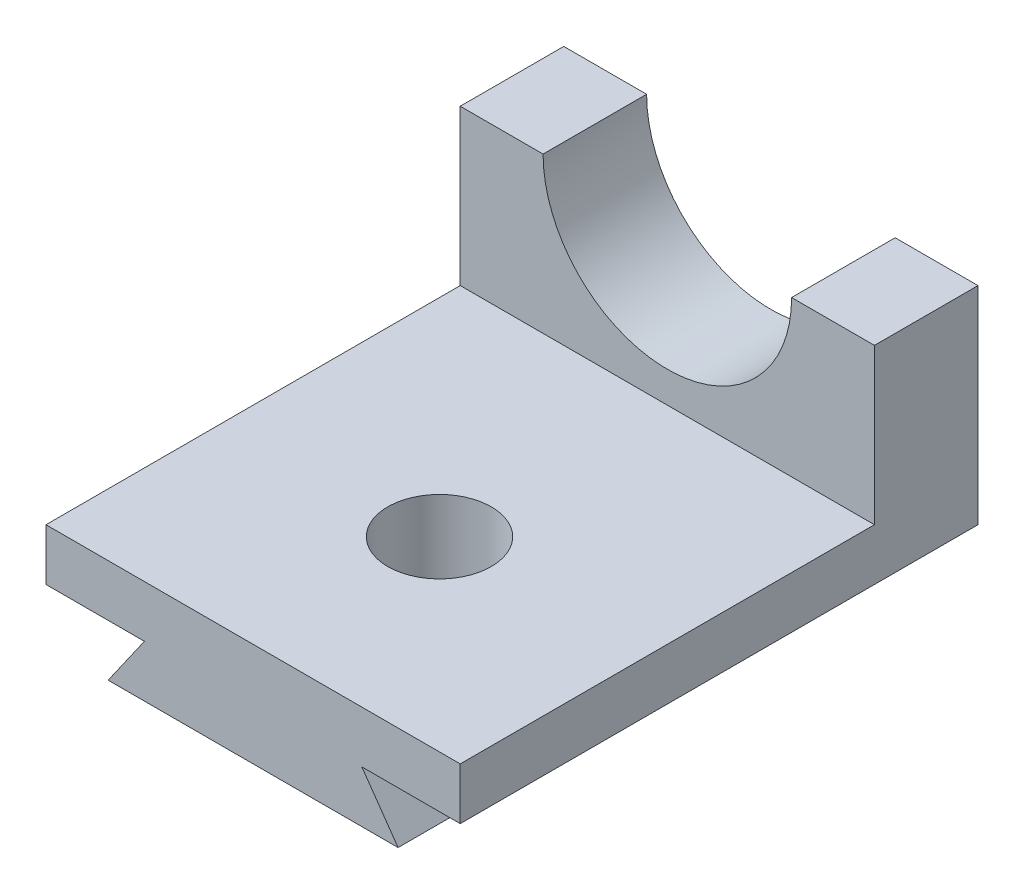
ISO-10303-21;
HEADER;
FILE_DESCRIPTION(('STEP AP214'),'2;1');
FILE_NAME('part.step','',(''),(''),'','','');
FILE_SCHEMA(('AUTOMOTIVE_DESIGN { 1 0 10303 214 1 1 1 1 }'));
ENDSEC;
DATA;
#1=APPLICATION_CONTEXT('core data for automotive mechanical design processes');
#2=APPLICATION_PROTOCOL_DEFINITION('international standard','automotive_design',2000,#1);
#3=PRODUCT_CONTEXT('',#1,'mechanical');
#4=PRODUCT('Part','Part','',(#3));
#5=PRODUCT_RELATED_PRODUCT_CATEGORY('part','',(#4));
#6=PRODUCT_DEFINITION_FORMATION('','',#4);
#7=PRODUCT_DEFINITION_CONTEXT('part definition',#1,'design');
#8=PRODUCT_DEFINITION('design','',#6,#7);
#9=PRODUCT_DEFINITION_SHAPE('','',#8);
#10=(LENGTH_UNIT() NAMED_UNIT(*) SI_UNIT(.MILLI.,.METRE.));
#11=(NAMED_UNIT(*) PLANE_ANGLE_UNIT() SI_UNIT($,.RADIAN.));
#12=(NAMED_UNIT(*) SI_UNIT($,.STERADIAN.) SOLID_ANGLE_UNIT());
#13=UNCERTAINTY_MEASURE_WITH_UNIT(LENGTH_MEASURE(1.E-05),#10,'distance_accuracy_value','');
#14=(GEOMETRIC_REPRESENTATION_CONTEXT(3) GLOBAL_UNCERTAINTY_ASSIGNED_CONTEXT((#13)) GLOBAL_UNIT_ASSIGNED_CONTEXT((#10,
#11,#12)) REPRESENTATION_CONTEXT('',''));
#15=CARTESIAN_POINT('',(0.,0.,0.));
#16=DIRECTION('',(0.,0.,1.));
#17=DIRECTION('',(1.,0.,0.));
#18=AXIS2_PLACEMENT_3D('',#15,#16,#17);
#19=CARTESIAN_POINT('',(0.,15.,0.));
#20=DIRECTION('',(0.,1.,0.));
#21=DIRECTION('',(0.,0.,1.));
#22=AXIS2_PLACEMENT_3D('',#19,#20,#21);
#23=PLANE('',#22);
#24=DIRECTION('',(0.,0.,1.));
#25=VECTOR('',#24,1.);
#26=CARTESIAN_POINT('',(-12.,15.,0.));
#27=LINE('',#26,#25);
#28=CARTESIAN_POINT('',(-12.,15.,0.));
#29=VERTEX_POINT('',#28);
#30=CARTESIAN_POINT('',(-12.,15.,10.));
#31=VERTEX_POINT('',#30);
#32=EDGE_CURVE('E141',#29,#31,#27,.T.);
#33=ORIENTED_EDGE('',*,*,#32,.F.);
#34=DIRECTION('',(-1.,0.,0.));
#35=VECTOR('',#34,1.);
#36=CARTESIAN_POINT('',(-20.,15.,0.));
#37=LINE('',#36,#35);
#38=CARTESIAN_POINT('',(-20.,15.,0.));
#39=VERTEX_POINT('',#38);
#40=EDGE_CURVE('E150',#29,#39,#37,.T.);
#41=ORIENTED_EDGE('',*,*,#40,.T.);
#42=DIRECTION('',(0.,0.,1.));
#43=VECTOR('',#42,1.);
#44=CARTESIAN_POINT('',(-20.,15.,0.));
#45=LINE('',#44,#43);
#46=CARTESIAN_POINT('',(-20.,15.,10.));
#47=VERTEX_POINT('',#46);
#48=EDGE_CURVE('E169',#39,#47,#45,.T.);
#49=ORIENTED_EDGE('',*,*,#48,.T.);
#50=DIRECTION('',(1.,0.,0.));
#51=VECTOR('',#50,1.);
#52=CARTESIAN_POINT('',(-20.,15.,10.));
#53=LINE('',#52,#51);
#54=EDGE_CURVE('E262',#47,#31,#53,.T.);
#55=ORIENTED_EDGE('',*,*,#54,.T.);
#56=EDGE_LOOP('',(#33,#41,#49,#55));
#57=FACE_BOUND('',#56,.T.);
#58=ADVANCED_FACE('F45',(#57),#23,.T.);
#59=CARTESIAN_POINT('',(-20.,0.,50.));
#60=DIRECTION('',(0.,-1.,0.));
#61=DIRECTION('',(0.,0.,-1.));
#62=AXIS2_PLACEMENT_3D('',#59,#60,#61);
#63=PLANE('',#62);
#64=CARTESIAN_POINT('',(0.,0.,32.));
#65=DIRECTION('',(0.,1.,0.));
#66=DIRECTION('',(0.,0.,1.));
#67=AXIS2_PLACEMENT_3D('',#64,#65,#66);
#68=CIRCLE('',#67,5.);
#69=CARTESIAN_POINT('',(0.,0.,37.));
#70=VERTEX_POINT('',#69);
#71=EDGE_CURVE('E174',#70,#70,#68,.T.);
#72=ORIENTED_EDGE('',*,*,#71,.F.);
#73=EDGE_LOOP('',(#72));
#74=FACE_BOUND('',#73,.T.);
#75=DIRECTION('',(1.,0.,0.));
#76=VECTOR('',#75,1.);
#77=CARTESIAN_POINT('',(-20.,0.,10.));
#78=LINE('',#77,#76);
#79=CARTESIAN_POINT('',(-20.,0.,10.));
#80=VERTEX_POINT('',#79);
#81=CARTESIAN_POINT('',(20.,0.,10.));
#82=VERTEX_POINT('',#81);
#83=EDGE_CURVE('E68',#80,#82,#78,.T.);
#84=ORIENTED_EDGE('',*,*,#83,.F.);
#85=DIRECTION('',(0.,0.,-1.));
#86=VECTOR('',#85,1.);
#87=CARTESIAN_POINT('',(-20.,0.,50.));
#88=LINE('',#87,#86);
#89=CARTESIAN_POINT('',(-20.,0.,50.));
#90=VERTEX_POINT('',#89);
#91=EDGE_CURVE('E54',#90,#80,#88,.T.);
#92=ORIENTED_EDGE('',*,*,#91,.F.);
#93=DIRECTION('',(-1.,0.,0.));
#94=VECTOR('',#93,1.);
#95=CARTESIAN_POINT('',(-20.,0.,50.));
#96=LINE('',#95,#94);
#97=CARTESIAN_POINT('',(20.,0.,50.));
#98=VERTEX_POINT('',#97);
#99=EDGE_CURVE('E187',#98,#90,#96,.T.);
#100=ORIENTED_EDGE('',*,*,#99,.F.);
#101=DIRECTION('',(0.,0.,-1.));
#102=VECTOR('',#101,1.);
#103=CARTESIAN_POINT('',(20.,0.,50.));
#104=LINE('',#103,#102);
#105=EDGE_CURVE('E11',#98,#82,#104,.T.);
#106=ORIENTED_EDGE('',*,*,#105,.T.);
#107=EDGE_LOOP('',(#84,#92,#100,#106));
#108=FACE_BOUND('',#107,.T.);
#109=ADVANCED_FACE('F305',(#74,#108),#63,.F.);
#110=CARTESIAN_POINT('',(20.,0.,50.));
#111=DIRECTION('',(-1.,0.,0.));
#112=DIRECTION('',(0.,0.,1.));
#113=AXIS2_PLACEMENT_3D('',#110,#111,#112);
#114=PLANE('',#113);
#115=DIRECTION('',(0.,1.,0.));
#116=VECTOR('',#115,1.);
#117=CARTESIAN_POINT('',(20.,0.,0.));
#118=LINE('',#117,#116);
#119=CARTESIAN_POINT('',(20.,-5.,0.));
#120=VERTEX_POINT('',#119);
#121=CARTESIAN_POINT('',(20.,15.,0.));
#122=VERTEX_POINT('',#121);
#123=EDGE_CURVE('E179',#120,#122,#118,.T.);
#124=ORIENTED_EDGE('',*,*,#123,.T.);
#125=DIRECTION('',(0.,0.,-1.));
#126=VECTOR('',#125,1.);
#127=CARTESIAN_POINT('',(20.,15.,0.));
#128=LINE('',#127,#126);
#129=CARTESIAN_POINT('',(20.,15.,10.));
#130=VERTEX_POINT('',#129);
#131=EDGE_CURVE('E156',#130,#122,#128,.T.);
#132=ORIENTED_EDGE('',*,*,#131,.F.);
#133=DIRECTION('',(0.,-1.,0.));
#134=VECTOR('',#133,1.);
#135=CARTESIAN_POINT('',(20.,15.,10.));
#136=LINE('',#135,#134);
#137=EDGE_CURVE('E158',#130,#82,#136,.T.);
#138=ORIENTED_EDGE('',*,*,#137,.T.);
#139=ORIENTED_EDGE('',*,*,#105,.F.);
#140=DIRECTION('',(0.,1.,0.));
#141=VECTOR('',#140,1.);
#142=CARTESIAN_POINT('',(20.,0.,50.));
#143=LINE('',#142,#141);
#144=CARTESIAN_POINT('',(20.,-5.,50.));
#145=VERTEX_POINT('',#144);
#146=EDGE_CURVE('E183',#145,#98,#143,.T.);
#147=ORIENTED_EDGE('',*,*,#146,.F.);
#148=DIRECTION('',(0.,0.,-1.));
#149=VECTOR('',#148,1.);
#150=CARTESIAN_POINT('',(20.,-5.,50.));
#151=LINE('',#150,#149);
#152=EDGE_CURVE('E209',#145,#120,#151,.T.);
#153=ORIENTED_EDGE('',*,*,#152,.T.);
#154=EDGE_LOOP('',(#124,#132,#138,#139,#147,#153));
#155=FACE_BOUND('',#154,.T.);
#156=ADVANCED_FACE('F47',(#155),#114,.F.);
#157=CARTESIAN_POINT('',(-20.,0.,50.));
#158=DIRECTION('',(1.,0.,0.));
#159=DIRECTION('',(0.,0.,-1.));
#160=AXIS2_PLACEMENT_3D('',#157,#158,#159);
#161=PLANE('',#160);
#162=DIRECTION('',(0.,-1.,0.));
#163=VECTOR('',#162,1.);
#164=CARTESIAN_POINT('',(-20.,0.,0.));
#165=LINE('',#164,#163);
#166=CARTESIAN_POINT('',(-20.,-5.,0.));
#167=VERTEX_POINT('',#166);
#168=EDGE_CURVE('E212',#39,#167,#165,.T.);
#169=ORIENTED_EDGE('',*,*,#168,.T.);
#170=DIRECTION('',(0.,0.,-1.));
#171=VECTOR('',#170,1.);
#172=CARTESIAN_POINT('',(-20.,-5.,50.));
#173=LINE('',#172,#171);
#174=CARTESIAN_POINT('',(-20.,-5.,50.));
#175=VERTEX_POINT('',#174);
#176=EDGE_CURVE('E248',#175,#167,#173,.T.);
#177=ORIENTED_EDGE('',*,*,#176,.F.);
#178=DIRECTION('',(0.,-1.,0.));
#179=VECTOR('',#178,1.);
#180=CARTESIAN_POINT('',(-20.,0.,50.));
#181=LINE('',#180,#179);
#182=EDGE_CURVE('E191',#90,#175,#181,.T.);
#183=ORIENTED_EDGE('',*,*,#182,.F.);
#184=ORIENTED_EDGE('',*,*,#91,.T.);
#185=DIRECTION('',(0.,-1.,0.));
#186=VECTOR('',#185,1.);
#187=CARTESIAN_POINT('',(-20.,15.,10.));
#188=LINE('',#187,#186);
#189=EDGE_CURVE('E163',#47,#80,#188,.T.);
#190=ORIENTED_EDGE('',*,*,#189,.F.);
#191=ORIENTED_EDGE('',*,*,#48,.F.);
#192=EDGE_LOOP('',(#169,#177,#183,#184,#190,#191));
#193=FACE_BOUND('',#192,.T.);
#194=ADVANCED_FACE('F255',(#193),#161,.F.);
#195=CARTESIAN_POINT('',(-20.,-5.,50.));
#196=DIRECTION('',(0.,1.,0.));
#197=DIRECTION('',(-1.,0.,0.));
#198=AXIS2_PLACEMENT_3D('',#195,#196,#197);
#199=PLANE('',#198);
#200=DIRECTION('',(1.,0.,0.));
#201=VECTOR('',#200,1.);
#202=CARTESIAN_POINT('',(-20.,-5.,0.));
#203=LINE('',#202,#201);
#204=CARTESIAN_POINT('',(-10.5,-5.,0.));
#205=VERTEX_POINT('',#204);
#206=EDGE_CURVE('E215',#167,#205,#203,.T.);
#207=ORIENTED_EDGE('',*,*,#206,.T.);
#208=DIRECTION('',(0.,0.,-1.));
#209=VECTOR('',#208,1.);
#210=CARTESIAN_POINT('',(-10.5,-5.,50.));
#211=LINE('',#210,#209);
#212=CARTESIAN_POINT('',(-10.5,-5.,50.));
#213=VERTEX_POINT('',#212);
#214=EDGE_CURVE('E244',#213,#205,#211,.T.);
#215=ORIENTED_EDGE('',*,*,#214,.F.);
#216=DIRECTION('',(1.,0.,0.));
#217=VECTOR('',#216,1.);
#218=CARTESIAN_POINT('',(-20.,-5.,50.));
#219=LINE('',#218,#217);
#220=EDGE_CURVE('E194',#175,#213,#219,.T.);
#221=ORIENTED_EDGE('',*,*,#220,.F.);
#222=ORIENTED_EDGE('',*,*,#176,.T.);
#223=EDGE_LOOP('',(#207,#215,#221,#222));
#224=FACE_BOUND('',#223,.T.);
#225=ADVANCED_FACE('F302',(#224),#199,.F.);
#226=CARTESIAN_POINT('',(-14.,-10.,50.));
#227=DIRECTION('',(0.819231920519041,-0.573462344363328,0.));
#228=DIRECTION('',(0.573462344363328,0.819231920519041,0.));
#229=AXIS2_PLACEMENT_3D('',#226,#227,#228);
#230=PLANE('',#229);
#231=DIRECTION('',(-0.573462344363328,-0.819231920519041,0.));
#232=VECTOR('',#231,1.);
#233=CARTESIAN_POINT('',(-14.,-10.,0.));
#234=LINE('',#233,#232);
#235=CARTESIAN_POINT('',(-14.,-10.,0.));
#236=VERTEX_POINT('',#235);
#237=EDGE_CURVE('E218',#205,#236,#234,.T.);
#238=ORIENTED_EDGE('',*,*,#237,.T.);
#239=DIRECTION('',(0.,0.,-1.));
#240=VECTOR('',#239,1.);
#241=CARTESIAN_POINT('',(-14.,-10.,50.));
#242=LINE('',#241,#240);
#243=CARTESIAN_POINT('',(-14.,-10.,50.));
#244=VERTEX_POINT('',#243);
#245=EDGE_CURVE('E240',#244,#236,#242,.T.);
#246=ORIENTED_EDGE('',*,*,#245,.F.);
#247=DIRECTION('',(-0.573462344363328,-0.819231920519041,0.));
#248=VECTOR('',#247,1.);
#249=CARTESIAN_POINT('',(-14.,-10.,50.));
#250=LINE('',#249,#248);
#251=EDGE_CURVE('E197',#213,#244,#250,.T.);
#252=ORIENTED_EDGE('',*,*,#251,.F.);
#253=ORIENTED_EDGE('',*,*,#214,.T.);
#254=EDGE_LOOP('',(#238,#246,#252,#253));
#255=FACE_BOUND('',#254,.T.);
#256=ADVANCED_FACE('F297',(#255),#230,.F.);
#257=CARTESIAN_POINT('',(-14.,-10.,50.));
#258=DIRECTION('',(0.,1.,0.));
#259=DIRECTION('',(0.,0.,1.));
#260=AXIS2_PLACEMENT_3D('',#257,#258,#259);
#261=PLANE('',#260);
#262=CARTESIAN_POINT('',(0.,-10.,32.));
#263=DIRECTION('',(0.,1.,0.));
#264=DIRECTION('',(0.,0.,1.));
#265=AXIS2_PLACEMENT_3D('',#262,#263,#264);
#266=CIRCLE('',#265,5.);
#267=CARTESIAN_POINT('',(0.,-10.,37.));
#268=VERTEX_POINT('',#267);
#269=EDGE_CURVE('E175',#268,#268,#266,.T.);
#270=ORIENTED_EDGE('',*,*,#269,.T.);
#271=EDGE_LOOP('',(#270));
#272=FACE_BOUND('',#271,.T.);
#273=DIRECTION('',(1.,0.,0.));
#274=VECTOR('',#273,1.);
#275=CARTESIAN_POINT('',(-14.,-10.,0.));
#276=LINE('',#275,#274);
#277=CARTESIAN_POINT('',(14.,-10.,0.));
#278=VERTEX_POINT('',#277);
#279=EDGE_CURVE('E221',#236,#278,#276,.T.);
#280=ORIENTED_EDGE('',*,*,#279,.T.);
#281=DIRECTION('',(0.,0.,-1.));
#282=VECTOR('',#281,1.);
#283=CARTESIAN_POINT('',(14.,-10.,50.));
#284=LINE('',#283,#282);
#285=CARTESIAN_POINT('',(14.,-10.,50.));
#286=VERTEX_POINT('',#285);
#287=EDGE_CURVE('E236',#286,#278,#284,.T.);
#288=ORIENTED_EDGE('',*,*,#287,.F.);
#289=DIRECTION('',(1.,0.,0.));
#290=VECTOR('',#289,1.);
#291=CARTESIAN_POINT('',(-14.,-10.,50.));
#292=LINE('',#291,#290);
#293=EDGE_CURVE('E200',#244,#286,#292,.T.);
#294=ORIENTED_EDGE('',*,*,#293,.F.);
#295=ORIENTED_EDGE('',*,*,#245,.T.);
#296=EDGE_LOOP('',(#280,#288,#294,#295));
#297=FACE_BOUND('',#296,.T.);
#298=ADVANCED_FACE('F292',(#272,#297),#261,.F.);
#299=CARTESIAN_POINT('',(14.,-10.,50.));
#300=DIRECTION('',(-0.819231920519041,-0.573462344363328,0.));
#301=DIRECTION('',(0.573462344363328,-0.819231920519041,0.));
#302=AXIS2_PLACEMENT_3D('',#299,#300,#301);
#303=PLANE('',#302);
#304=DIRECTION('',(-0.573462344363328,0.819231920519041,0.));
#305=VECTOR('',#304,1.);
#306=CARTESIAN_POINT('',(14.,-10.,0.));
#307=LINE('',#306,#305);
#308=CARTESIAN_POINT('',(10.5,-5.,0.));
#309=VERTEX_POINT('',#308);
#310=EDGE_CURVE('E224',#278,#309,#307,.T.);
#311=ORIENTED_EDGE('',*,*,#310,.T.);
#312=DIRECTION('',(0.,0.,-1.));
#313=VECTOR('',#312,1.);
#314=CARTESIAN_POINT('',(10.5,-5.,50.));
#315=LINE('',#314,#313);
#316=CARTESIAN_POINT('',(10.5,-5.,50.));
#317=VERTEX_POINT('',#316);
#318=EDGE_CURVE('E232',#317,#309,#315,.T.);
#319=ORIENTED_EDGE('',*,*,#318,.F.);
#320=DIRECTION('',(-0.573462344363328,0.819231920519041,0.));
#321=VECTOR('',#320,1.);
#322=CARTESIAN_POINT('',(14.,-10.,50.));
#323=LINE('',#322,#321);
#324=EDGE_CURVE('E203',#286,#317,#323,.T.);
#325=ORIENTED_EDGE('',*,*,#324,.F.);
#326=ORIENTED_EDGE('',*,*,#287,.T.);
#327=EDGE_LOOP('',(#311,#319,#325,#326));
#328=FACE_BOUND('',#327,.T.);
#329=ADVANCED_FACE('F288',(#328),#303,.F.);
#330=CARTESIAN_POINT('',(20.,-5.,50.));
#331=DIRECTION('',(0.,1.,0.));
#332=DIRECTION('',(-1.,0.,0.));
#333=AXIS2_PLACEMENT_3D('',#330,#331,#332);
#334=PLANE('',#333);
#335=DIRECTION('',(1.,0.,0.));
#336=VECTOR('',#335,1.);
#337=CARTESIAN_POINT('',(20.,-5.,0.));
#338=LINE('',#337,#336);
#339=EDGE_CURVE('E188',#309,#120,#338,.T.);
#340=ORIENTED_EDGE('',*,*,#339,.T.);
#341=ORIENTED_EDGE('',*,*,#152,.F.);
#342=DIRECTION('',(1.,0.,0.));
#343=VECTOR('',#342,1.);
#344=CARTESIAN_POINT('',(20.,-5.,50.));
#345=LINE('',#344,#343);
#346=EDGE_CURVE('E206',#317,#145,#345,.T.);
#347=ORIENTED_EDGE('',*,*,#346,.F.);
#348=ORIENTED_EDGE('',*,*,#318,.T.);
#349=EDGE_LOOP('',(#340,#341,#347,#348));
#350=FACE_BOUND('',#349,.T.);
#351=ADVANCED_FACE('F283',(#350),#334,.F.);
#352=CARTESIAN_POINT('',(0.,0.,50.));
#353=DIRECTION('',(0.,0.,-1.));
#354=DIRECTION('',(-1.,0.,0.));
#355=AXIS2_PLACEMENT_3D('',#352,#353,#354);
#356=PLANE('',#355);
#357=ORIENTED_EDGE('',*,*,#146,.T.);
#358=ORIENTED_EDGE('',*,*,#99,.T.);
#359=ORIENTED_EDGE('',*,*,#182,.T.);
#360=ORIENTED_EDGE('',*,*,#220,.T.);
#361=ORIENTED_EDGE('',*,*,#251,.T.);
#362=ORIENTED_EDGE('',*,*,#293,.T.);
#363=ORIENTED_EDGE('',*,*,#324,.T.);
#364=ORIENTED_EDGE('',*,*,#346,.T.);
#365=EDGE_LOOP('',(#357,#358,#359,#360,#361,#362,#363,#364));
#366=FACE_BOUND('',#365,.T.);
#367=ADVANCED_FACE('F304',(#366),#356,.F.);
#368=CARTESIAN_POINT('',(0.,0.,0.));
#369=DIRECTION('',(0.,0.,-1.));
#370=DIRECTION('',(-1.,0.,0.));
#371=AXIS2_PLACEMENT_3D('',#368,#369,#370);
#372=PLANE('',#371);
#373=CARTESIAN_POINT('',(0.,15.,0.));
#374=DIRECTION('',(0.,0.,1.));
#375=DIRECTION('',(1.,0.,0.));
#376=AXIS2_PLACEMENT_3D('',#373,#374,#375);
#377=CIRCLE('',#376,12.);
#378=CARTESIAN_POINT('',(12.,15.,0.));
#379=VERTEX_POINT('',#378);
#380=EDGE_CURVE('E135',#29,#379,#377,.T.);
#381=ORIENTED_EDGE('',*,*,#380,.T.);
#382=EDGE_CURVE('E148',#122,#379,#37,.T.);
#383=ORIENTED_EDGE('',*,*,#382,.F.);
#384=ORIENTED_EDGE('',*,*,#123,.F.);
#385=ORIENTED_EDGE('',*,*,#339,.F.);
#386=ORIENTED_EDGE('',*,*,#310,.F.);
#387=ORIENTED_EDGE('',*,*,#279,.F.);
#388=ORIENTED_EDGE('',*,*,#237,.F.);
#389=ORIENTED_EDGE('',*,*,#206,.F.);
#390=ORIENTED_EDGE('',*,*,#168,.F.);
#391=ORIENTED_EDGE('',*,*,#40,.F.);
#392=EDGE_LOOP('',(#381,#383,#384,#385,#386,#387,#388,#389,#390,#391));
#393=FACE_BOUND('',#392,.T.);
#394=ADVANCED_FACE('F146',(#393),#372,.T.);
#395=CARTESIAN_POINT('',(0.,-10.,32.));
#396=DIRECTION('',(0.,1.,0.));
#397=DIRECTION('',(0.,0.,1.));
#398=AXIS2_PLACEMENT_3D('',#395,#396,#397);
#399=CYLINDRICAL_SURFACE('',#398,5.);
#400=ORIENTED_EDGE('',*,*,#269,.F.);
#401=EDGE_LOOP('',(#400));
#402=FACE_BOUND('',#401,.T.);
#403=ORIENTED_EDGE('',*,*,#71,.T.);
#404=EDGE_LOOP('',(#403));
#405=FACE_BOUND('',#404,.T.);
#406=ADVANCED_FACE('F331',(#402,#405),#399,.F.);
#407=CARTESIAN_POINT('',(-20.,15.,10.));
#408=DIRECTION('',(0.,0.,-1.));
#409=DIRECTION('',(-1.,0.,0.));
#410=AXIS2_PLACEMENT_3D('',#407,#408,#409);
#411=PLANE('',#410);
#412=CARTESIAN_POINT('',(12.,15.,10.));
#413=VERTEX_POINT('',#412);
#414=EDGE_CURVE('E266',#413,#130,#53,.T.);
#415=ORIENTED_EDGE('',*,*,#414,.F.);
#416=CARTESIAN_POINT('',(0.,15.,10.));
#417=DIRECTION('',(0.,0.,1.));
#418=DIRECTION('',(1.,0.,0.));
#419=AXIS2_PLACEMENT_3D('',#416,#417,#418);
#420=CIRCLE('',#419,12.);
#421=EDGE_CURVE('E61',#31,#413,#420,.T.);
#422=ORIENTED_EDGE('',*,*,#421,.F.);
#423=ORIENTED_EDGE('',*,*,#54,.F.);
#424=ORIENTED_EDGE('',*,*,#189,.T.);
#425=ORIENTED_EDGE('',*,*,#83,.T.);
#426=ORIENTED_EDGE('',*,*,#137,.F.);
#427=EDGE_LOOP('',(#415,#422,#423,#424,#425,#426));
#428=FACE_BOUND('',#427,.T.);
#429=ADVANCED_FACE('F259',(#428),#411,.F.);
#430=DIRECTION('',(0.,0.,1.));
#431=VECTOR('',#430,1.);
#432=CARTESIAN_POINT('',(12.,15.,0.));
#433=LINE('',#432,#431);
#434=EDGE_CURVE('E132',#379,#413,#433,.T.);
#435=ORIENTED_EDGE('',*,*,#434,.T.);
#436=ORIENTED_EDGE('',*,*,#414,.T.);
#437=ORIENTED_EDGE('',*,*,#131,.T.);
#438=ORIENTED_EDGE('',*,*,#382,.T.);
#439=EDGE_LOOP('',(#435,#436,#437,#438));
#440=FACE_BOUND('',#439,.T.);
#441=ADVANCED_FACE('F154',(#440),#23,.T.);
#442=CARTESIAN_POINT('',(0.,15.,0.));
#443=DIRECTION('',(0.,0.,1.));
#444=DIRECTION('',(1.,0.,0.));
#445=AXIS2_PLACEMENT_3D('',#442,#443,#444);
#446=CYLINDRICAL_SURFACE('',#445,12.);
#447=ORIENTED_EDGE('',*,*,#421,.T.);
#448=ORIENTED_EDGE('',*,*,#434,.F.);
#449=ORIENTED_EDGE('',*,*,#380,.F.);
#450=ORIENTED_EDGE('',*,*,#32,.T.);
#451=EDGE_LOOP('',(#447,#448,#449,#450));
#452=FACE_BOUND('',#451,.T.);
#453=ADVANCED_FACE('F134',(#452),#446,.F.);
#454=CLOSED_SHELL('',(#58,#109,#156,#194,#225,#256,#298,#329,#351,#367,#394,#406,#429,#441,#453));
#455=MANIFOLD_SOLID_BREP('B2',#454);
#456=ADVANCED_BREP_SHAPE_REPRESENTATION('',(#18,#455),#14);
#457=SHAPE_DEFINITION_REPRESENTATION(#9,#456);
ENDSEC;
END-ISO-10303-21;
